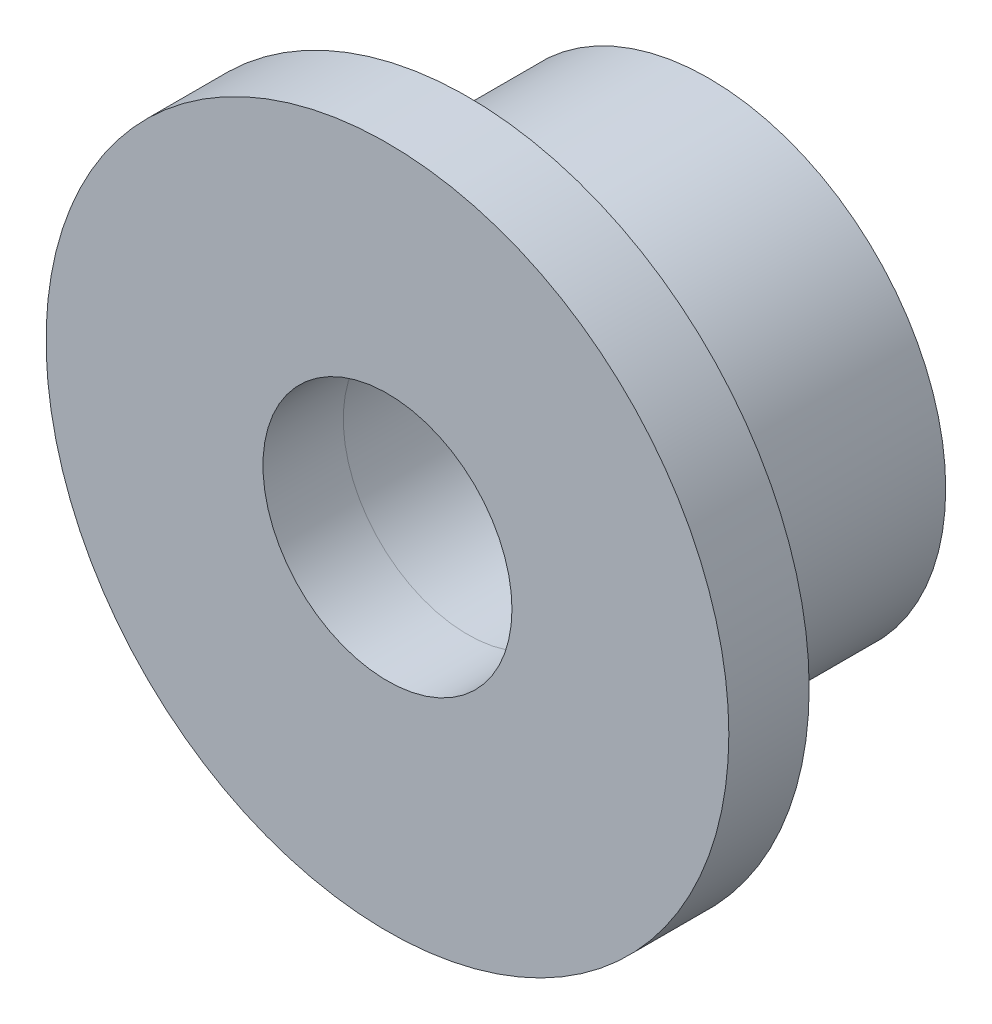
ISO-10303-21;
HEADER;
FILE_DESCRIPTION(('STEP AP214'),'2;1');
FILE_NAME('part.step','',(''),(''),'','','');
FILE_SCHEMA(('AUTOMOTIVE_DESIGN { 1 0 10303 214 1 1 1 1 }'));
ENDSEC;
DATA;
#1=APPLICATION_CONTEXT('core data for automotive mechanical design processes');
#2=APPLICATION_PROTOCOL_DEFINITION('international standard','automotive_design',2000,#1);
#3=PRODUCT_CONTEXT('',#1,'mechanical');
#4=PRODUCT('Part','Part','',(#3));
#5=PRODUCT_RELATED_PRODUCT_CATEGORY('part','',(#4));
#6=PRODUCT_DEFINITION_FORMATION('','',#4);
#7=PRODUCT_DEFINITION_CONTEXT('part definition',#1,'design');
#8=PRODUCT_DEFINITION('design','',#6,#7);
#9=PRODUCT_DEFINITION_SHAPE('','',#8);
#10=(LENGTH_UNIT() NAMED_UNIT(*) SI_UNIT(.MILLI.,.METRE.));
#11=(NAMED_UNIT(*) PLANE_ANGLE_UNIT() SI_UNIT($,.RADIAN.));
#12=(NAMED_UNIT(*) SI_UNIT($,.STERADIAN.) SOLID_ANGLE_UNIT());
#13=UNCERTAINTY_MEASURE_WITH_UNIT(LENGTH_MEASURE(1.E-05),#10,'distance_accuracy_value','');
#14=(GEOMETRIC_REPRESENTATION_CONTEXT(3) GLOBAL_UNCERTAINTY_ASSIGNED_CONTEXT((#13)) GLOBAL_UNIT_ASSIGNED_CONTEXT((#10,
#11,#12)) REPRESENTATION_CONTEXT('',''));
#15=CARTESIAN_POINT('',(0.,0.,0.));
#16=DIRECTION('',(0.,0.,1.));
#17=DIRECTION('',(1.,0.,0.));
#18=AXIS2_PLACEMENT_3D('',#15,#16,#17);
#19=CARTESIAN_POINT('',(0.,0.,4.));
#20=DIRECTION('',(0.,0.,1.));
#21=DIRECTION('',(1.,0.,0.));
#22=AXIS2_PLACEMENT_3D('',#19,#20,#21);
#23=PLANE('',#22);
#24=CARTESIAN_POINT('',(0.,0.,4.));
#25=DIRECTION('',(0.,0.,1.));
#26=DIRECTION('',(1.,0.,0.));
#27=AXIS2_PLACEMENT_3D('',#24,#25,#26);
#28=CIRCLE('',#27,4.25);
#29=CARTESIAN_POINT('',(4.25,0.,4.));
#30=VERTEX_POINT('',#29);
#31=EDGE_CURVE('E11',#30,#30,#28,.T.);
#32=ORIENTED_EDGE('',*,*,#31,.T.);
#33=EDGE_LOOP('',(#32));
#34=FACE_BOUND('',#33,.T.);
#35=CARTESIAN_POINT('',(0.,0.,4.));
#36=DIRECTION('',(0.,0.,1.));
#37=DIRECTION('',(1.,0.,0.));
#38=AXIS2_PLACEMENT_3D('',#35,#36,#37);
#39=CIRCLE('',#38,1.55);
#40=CARTESIAN_POINT('',(1.55,0.,4.));
#41=VERTEX_POINT('',#40);
#42=EDGE_CURVE('E53',#41,#41,#39,.T.);
#43=ORIENTED_EDGE('',*,*,#42,.F.);
#44=EDGE_LOOP('',(#43));
#45=FACE_BOUND('',#44,.T.);
#46=ADVANCED_FACE('F42',(#34,#45),#23,.T.);
#47=CARTESIAN_POINT('',(0.,0.,3.));
#48=DIRECTION('',(0.,0.,1.));
#49=DIRECTION('',(1.,0.,0.));
#50=AXIS2_PLACEMENT_3D('',#47,#48,#49);
#51=PLANE('',#50);
#52=CARTESIAN_POINT('',(0.,0.,3.));
#53=DIRECTION('',(0.,0.,1.));
#54=DIRECTION('',(1.,0.,0.));
#55=AXIS2_PLACEMENT_3D('',#52,#53,#54);
#56=CIRCLE('',#55,4.25);
#57=CARTESIAN_POINT('',(4.25,0.,3.));
#58=VERTEX_POINT('',#57);
#59=EDGE_CURVE('E46',#58,#58,#56,.T.);
#60=ORIENTED_EDGE('',*,*,#59,.F.);
#61=EDGE_LOOP('',(#60));
#62=FACE_BOUND('',#61,.T.);
#63=CARTESIAN_POINT('',(0.,0.,3.));
#64=DIRECTION('',(0.,0.,1.));
#65=DIRECTION('',(1.,0.,0.));
#66=AXIS2_PLACEMENT_3D('',#63,#64,#65);
#67=CIRCLE('',#66,1.55);
#68=CARTESIAN_POINT('',(1.55,0.,3.));
#69=VERTEX_POINT('',#68);
#70=EDGE_CURVE('E55',#69,#69,#67,.T.);
#71=ORIENTED_EDGE('',*,*,#70,.T.);
#72=EDGE_LOOP('',(#71));
#73=FACE_BOUND('',#72,.T.);
#74=ADVANCED_FACE('F65',(#62,#73),#51,.F.);
#75=CARTESIAN_POINT('',(0.,0.,4.));
#76=DIRECTION('',(0.,0.,-1.));
#77=DIRECTION('',(-1.,0.,0.));
#78=AXIS2_PLACEMENT_3D('',#75,#76,#77);
#79=CYLINDRICAL_SURFACE('',#78,4.25);
#80=ORIENTED_EDGE('',*,*,#31,.F.);
#81=EDGE_LOOP('',(#80));
#82=FACE_BOUND('',#81,.T.);
#83=ORIENTED_EDGE('',*,*,#59,.T.);
#84=EDGE_LOOP('',(#83));
#85=FACE_BOUND('',#84,.T.);
#86=ADVANCED_FACE('F44',(#82,#85),#79,.T.);
#87=CARTESIAN_POINT('',(0.,0.,4.));
#88=DIRECTION('',(0.,0.,-1.));
#89=DIRECTION('',(-1.,0.,0.));
#90=AXIS2_PLACEMENT_3D('',#87,#88,#89);
#91=CYLINDRICAL_SURFACE('',#90,1.55);
#92=ORIENTED_EDGE('',*,*,#42,.T.);
#93=EDGE_LOOP('',(#92));
#94=FACE_BOUND('',#93,.T.);
#95=ORIENTED_EDGE('',*,*,#70,.F.);
#96=EDGE_LOOP('',(#95));
#97=FACE_BOUND('',#96,.T.);
#98=ADVANCED_FACE('F61',(#94,#97),#91,.F.);
#99=CLOSED_SHELL('',(#46,#74,#86,#98));
#100=MANIFOLD_SOLID_BREP('B2',#99);
#101=CARTESIAN_POINT('',(0.,0.,3.));
#102=DIRECTION('',(0.,0.,1.));
#103=DIRECTION('',(1.,0.,0.));
#104=AXIS2_PLACEMENT_3D('',#101,#102,#103);
#105=PLANE('',#104);
#106=CARTESIAN_POINT('',(0.,0.,3.));
#107=DIRECTION('',(0.,0.,1.));
#108=DIRECTION('',(1.,0.,0.));
#109=AXIS2_PLACEMENT_3D('',#106,#107,#108);
#110=CIRCLE('',#109,2.95);
#111=CARTESIAN_POINT('',(2.95,0.,3.));
#112=VERTEX_POINT('',#111);
#113=EDGE_CURVE('E41',#112,#112,#110,.T.);
#114=ORIENTED_EDGE('',*,*,#113,.T.);
#115=EDGE_LOOP('',(#114));
#116=FACE_BOUND('',#115,.T.);
#117=CARTESIAN_POINT('',(0.,0.,3.));
#118=DIRECTION('',(0.,0.,1.));
#119=DIRECTION('',(1.,0.,0.));
#120=AXIS2_PLACEMENT_3D('',#117,#118,#119);
#121=CIRCLE('',#120,1.55);
#122=CARTESIAN_POINT('',(1.55,0.,3.));
#123=VERTEX_POINT('',#122);
#124=EDGE_CURVE('E114',#123,#123,#121,.T.);
#125=ORIENTED_EDGE('',*,*,#124,.F.);
#126=EDGE_LOOP('',(#125));
#127=FACE_BOUND('',#126,.T.);
#128=ADVANCED_FACE('F103',(#116,#127),#105,.T.);
#129=CARTESIAN_POINT('',(0.,0.,0.));
#130=DIRECTION('',(0.,0.,1.));
#131=DIRECTION('',(1.,0.,0.));
#132=AXIS2_PLACEMENT_3D('',#129,#130,#131);
#133=PLANE('',#132);
#134=CARTESIAN_POINT('',(0.,0.,0.));
#135=DIRECTION('',(0.,0.,1.));
#136=DIRECTION('',(1.,0.,0.));
#137=AXIS2_PLACEMENT_3D('',#134,#135,#136);
#138=CIRCLE('',#137,2.95);
#139=CARTESIAN_POINT('',(2.95,0.,0.));
#140=VERTEX_POINT('',#139);
#141=EDGE_CURVE('E107',#140,#140,#138,.T.);
#142=ORIENTED_EDGE('',*,*,#141,.F.);
#143=EDGE_LOOP('',(#142));
#144=FACE_BOUND('',#143,.T.);
#145=CARTESIAN_POINT('',(0.,0.,0.));
#146=DIRECTION('',(0.,0.,1.));
#147=DIRECTION('',(1.,0.,0.));
#148=AXIS2_PLACEMENT_3D('',#145,#146,#147);
#149=CIRCLE('',#148,1.55);
#150=CARTESIAN_POINT('',(1.55,0.,0.));
#151=VERTEX_POINT('',#150);
#152=EDGE_CURVE('E116',#151,#151,#149,.T.);
#153=ORIENTED_EDGE('',*,*,#152,.T.);
#154=EDGE_LOOP('',(#153));
#155=FACE_BOUND('',#154,.T.);
#156=ADVANCED_FACE('F126',(#144,#155),#133,.F.);
#157=CARTESIAN_POINT('',(0.,0.,3.));
#158=DIRECTION('',(0.,0.,-1.));
#159=DIRECTION('',(-1.,0.,0.));
#160=AXIS2_PLACEMENT_3D('',#157,#158,#159);
#161=CYLINDRICAL_SURFACE('',#160,2.95);
#162=ORIENTED_EDGE('',*,*,#113,.F.);
#163=EDGE_LOOP('',(#162));
#164=FACE_BOUND('',#163,.T.);
#165=ORIENTED_EDGE('',*,*,#141,.T.);
#166=EDGE_LOOP('',(#165));
#167=FACE_BOUND('',#166,.T.);
#168=ADVANCED_FACE('F105',(#164,#167),#161,.T.);
#169=CARTESIAN_POINT('',(0.,0.,3.));
#170=DIRECTION('',(0.,0.,-1.));
#171=DIRECTION('',(-1.,0.,0.));
#172=AXIS2_PLACEMENT_3D('',#169,#170,#171);
#173=CYLINDRICAL_SURFACE('',#172,1.55);
#174=ORIENTED_EDGE('',*,*,#124,.T.);
#175=EDGE_LOOP('',(#174));
#176=FACE_BOUND('',#175,.T.);
#177=ORIENTED_EDGE('',*,*,#152,.F.);
#178=EDGE_LOOP('',(#177));
#179=FACE_BOUND('',#178,.T.);
#180=ADVANCED_FACE('F122',(#176,#179),#173,.F.);
#181=CLOSED_SHELL('',(#128,#156,#168,#180));
#182=MANIFOLD_SOLID_BREP('B6',#181);
#183=ADVANCED_BREP_SHAPE_REPRESENTATION('',(#18,#100,#182),#14);
#184=SHAPE_DEFINITION_REPRESENTATION(#9,#183);
ENDSEC;
END-ISO-10303-21;
